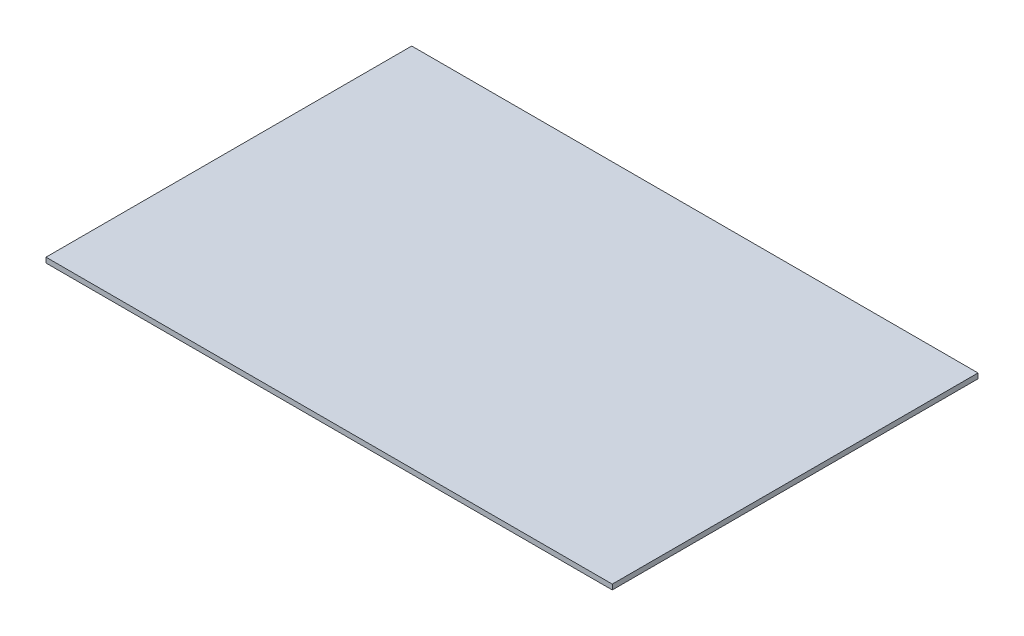
ISO-10303-21;
HEADER;
FILE_DESCRIPTION(('STEP AP214'),'2;1');
FILE_NAME('part.step','',(''),(''),'','','');
FILE_SCHEMA(('AUTOMOTIVE_DESIGN { 1 0 10303 214 1 1 1 1 }'));
ENDSEC;
DATA;
#1=APPLICATION_CONTEXT('core data for automotive mechanical design processes');
#2=APPLICATION_PROTOCOL_DEFINITION('international standard','automotive_design',2000,#1);
#3=PRODUCT_CONTEXT('',#1,'mechanical');
#4=PRODUCT('Part','Part','',(#3));
#5=PRODUCT_RELATED_PRODUCT_CATEGORY('part','',(#4));
#6=PRODUCT_DEFINITION_FORMATION('','',#4);
#7=PRODUCT_DEFINITION_CONTEXT('part definition',#1,'design');
#8=PRODUCT_DEFINITION('design','',#6,#7);
#9=PRODUCT_DEFINITION_SHAPE('','',#8);
#10=(LENGTH_UNIT() NAMED_UNIT(*) SI_UNIT(.MILLI.,.METRE.));
#11=(NAMED_UNIT(*) PLANE_ANGLE_UNIT() SI_UNIT($,.RADIAN.));
#12=(NAMED_UNIT(*) SI_UNIT($,.STERADIAN.) SOLID_ANGLE_UNIT());
#13=UNCERTAINTY_MEASURE_WITH_UNIT(LENGTH_MEASURE(1.E-05),#10,'distance_accuracy_value','');
#14=(GEOMETRIC_REPRESENTATION_CONTEXT(3) GLOBAL_UNCERTAINTY_ASSIGNED_CONTEXT((#13)) GLOBAL_UNIT_ASSIGNED_CONTEXT((#10,
#11,#12)) REPRESENTATION_CONTEXT('',''));
#15=CARTESIAN_POINT('',(0.,0.,0.));
#16=DIRECTION('',(0.,0.,1.));
#17=DIRECTION('',(1.,0.,0.));
#18=AXIS2_PLACEMENT_3D('',#15,#16,#17);
#19=CARTESIAN_POINT('',(0.,5.5,0.));
#20=DIRECTION('',(1.,0.,0.));
#21=DIRECTION('',(0.,0.,-1.));
#22=AXIS2_PLACEMENT_3D('',#19,#20,#21);
#23=PLANE('',#22);
#24=DIRECTION('',(0.,0.,1.));
#25=VECTOR('',#24,1.);
#26=CARTESIAN_POINT('',(0.,0.,0.));
#27=LINE('',#26,#25);
#28=CARTESIAN_POINT('',(0.,0.,-393.7));
#29=VERTEX_POINT('',#28);
#30=CARTESIAN_POINT('',(0.,0.,0.));
#31=VERTEX_POINT('',#30);
#32=EDGE_CURVE('E115',#29,#31,#27,.T.);
#33=ORIENTED_EDGE('',*,*,#32,.T.);
#34=DIRECTION('',(0.,-1.,0.));
#35=VECTOR('',#34,1.);
#36=CARTESIAN_POINT('',(0.,5.5,0.));
#37=LINE('',#36,#35);
#38=CARTESIAN_POINT('',(0.,5.5,0.));
#39=VERTEX_POINT('',#38);
#40=EDGE_CURVE('E11',#39,#31,#37,.T.);
#41=ORIENTED_EDGE('',*,*,#40,.F.);
#42=DIRECTION('',(0.,0.,1.));
#43=VECTOR('',#42,1.);
#44=CARTESIAN_POINT('',(0.,5.5,0.));
#45=LINE('',#44,#43);
#46=CARTESIAN_POINT('',(0.,5.5,-393.7));
#47=VERTEX_POINT('',#46);
#48=EDGE_CURVE('E99',#47,#39,#45,.T.);
#49=ORIENTED_EDGE('',*,*,#48,.F.);
#50=DIRECTION('',(0.,-1.,0.));
#51=VECTOR('',#50,1.);
#52=CARTESIAN_POINT('',(0.,5.5,-393.7));
#53=LINE('',#52,#51);
#54=EDGE_CURVE('E111',#47,#29,#53,.T.);
#55=ORIENTED_EDGE('',*,*,#54,.T.);
#56=EDGE_LOOP('',(#33,#41,#49,#55));
#57=FACE_BOUND('',#56,.T.);
#58=ADVANCED_FACE('F47',(#57),#23,.F.);
#59=CARTESIAN_POINT('',(0.,5.5,0.));
#60=DIRECTION('',(0.,0.,-1.));
#61=DIRECTION('',(-1.,0.,0.));
#62=AXIS2_PLACEMENT_3D('',#59,#60,#61);
#63=PLANE('',#62);
#64=DIRECTION('',(1.,0.,0.));
#65=VECTOR('',#64,1.);
#66=CARTESIAN_POINT('',(0.,0.,0.));
#67=LINE('',#66,#65);
#68=CARTESIAN_POINT('',(609.6,0.,0.));
#69=VERTEX_POINT('',#68);
#70=EDGE_CURVE('E104',#31,#69,#67,.T.);
#71=ORIENTED_EDGE('',*,*,#70,.T.);
#72=DIRECTION('',(0.,-1.,0.));
#73=VECTOR('',#72,1.);
#74=CARTESIAN_POINT('',(609.6,5.5,0.));
#75=LINE('',#74,#73);
#76=CARTESIAN_POINT('',(609.6,5.5,0.));
#77=VERTEX_POINT('',#76);
#78=EDGE_CURVE('E56',#77,#69,#75,.T.);
#79=ORIENTED_EDGE('',*,*,#78,.F.);
#80=DIRECTION('',(1.,0.,0.));
#81=VECTOR('',#80,1.);
#82=CARTESIAN_POINT('',(0.,5.5,0.));
#83=LINE('',#82,#81);
#84=EDGE_CURVE('E94',#39,#77,#83,.T.);
#85=ORIENTED_EDGE('',*,*,#84,.F.);
#86=ORIENTED_EDGE('',*,*,#40,.T.);
#87=EDGE_LOOP('',(#71,#79,#85,#86));
#88=FACE_BOUND('',#87,.T.);
#89=ADVANCED_FACE('F103',(#88),#63,.F.);
#90=CARTESIAN_POINT('',(609.6,5.5,0.));
#91=DIRECTION('',(-1.,0.,0.));
#92=DIRECTION('',(0.,0.,1.));
#93=AXIS2_PLACEMENT_3D('',#90,#91,#92);
#94=PLANE('',#93);
#95=DIRECTION('',(0.,0.,-1.));
#96=VECTOR('',#95,1.);
#97=CARTESIAN_POINT('',(609.6,0.,0.));
#98=LINE('',#97,#96);
#99=CARTESIAN_POINT('',(609.6,0.,-393.7));
#100=VERTEX_POINT('',#99);
#101=EDGE_CURVE('E81',#69,#100,#98,.T.);
#102=ORIENTED_EDGE('',*,*,#101,.T.);
#103=DIRECTION('',(0.,-1.,0.));
#104=VECTOR('',#103,1.);
#105=CARTESIAN_POINT('',(609.6,5.5,-393.7));
#106=LINE('',#105,#104);
#107=CARTESIAN_POINT('',(609.6,5.5,-393.7));
#108=VERTEX_POINT('',#107);
#109=EDGE_CURVE('E106',#108,#100,#106,.T.);
#110=ORIENTED_EDGE('',*,*,#109,.F.);
#111=DIRECTION('',(0.,0.,-1.));
#112=VECTOR('',#111,1.);
#113=CARTESIAN_POINT('',(609.6,5.5,0.));
#114=LINE('',#113,#112);
#115=EDGE_CURVE('E97',#77,#108,#114,.T.);
#116=ORIENTED_EDGE('',*,*,#115,.F.);
#117=ORIENTED_EDGE('',*,*,#78,.T.);
#118=EDGE_LOOP('',(#102,#110,#116,#117));
#119=FACE_BOUND('',#118,.T.);
#120=ADVANCED_FACE('F107',(#119),#94,.F.);
#121=CARTESIAN_POINT('',(0.,5.5,-393.7));
#122=DIRECTION('',(0.,0.,1.));
#123=DIRECTION('',(1.,0.,0.));
#124=AXIS2_PLACEMENT_3D('',#121,#122,#123);
#125=PLANE('',#124);
#126=DIRECTION('',(-1.,0.,0.));
#127=VECTOR('',#126,1.);
#128=CARTESIAN_POINT('',(0.,0.,-393.7));
#129=LINE('',#128,#127);
#130=EDGE_CURVE('E87',#100,#29,#129,.T.);
#131=ORIENTED_EDGE('',*,*,#130,.T.);
#132=ORIENTED_EDGE('',*,*,#54,.F.);
#133=DIRECTION('',(-1.,0.,0.));
#134=VECTOR('',#133,1.);
#135=CARTESIAN_POINT('',(0.,5.5,-393.7));
#136=LINE('',#135,#134);
#137=EDGE_CURVE('E64',#108,#47,#136,.T.);
#138=ORIENTED_EDGE('',*,*,#137,.F.);
#139=ORIENTED_EDGE('',*,*,#109,.T.);
#140=EDGE_LOOP('',(#131,#132,#138,#139));
#141=FACE_BOUND('',#140,.T.);
#142=ADVANCED_FACE('F128',(#141),#125,.F.);
#143=CARTESIAN_POINT('',(0.,5.5,0.));
#144=DIRECTION('',(0.,-1.,0.));
#145=DIRECTION('',(0.,0.,-1.));
#146=AXIS2_PLACEMENT_3D('',#143,#144,#145);
#147=PLANE('',#146);
#148=ORIENTED_EDGE('',*,*,#48,.T.);
#149=ORIENTED_EDGE('',*,*,#84,.T.);
#150=ORIENTED_EDGE('',*,*,#115,.T.);
#151=ORIENTED_EDGE('',*,*,#137,.T.);
#152=EDGE_LOOP('',(#148,#149,#150,#151));
#153=FACE_BOUND('',#152,.T.);
#154=ADVANCED_FACE('F95',(#153),#147,.F.);
#155=CARTESIAN_POINT('',(0.,0.,0.));
#156=DIRECTION('',(0.,-1.,0.));
#157=DIRECTION('',(0.,0.,-1.));
#158=AXIS2_PLACEMENT_3D('',#155,#156,#157);
#159=PLANE('',#158);
#160=ORIENTED_EDGE('',*,*,#32,.F.);
#161=ORIENTED_EDGE('',*,*,#130,.F.);
#162=ORIENTED_EDGE('',*,*,#101,.F.);
#163=ORIENTED_EDGE('',*,*,#70,.F.);
#164=EDGE_LOOP('',(#160,#161,#162,#163));
#165=FACE_BOUND('',#164,.T.);
#166=ADVANCED_FACE('F131',(#165),#159,.T.);
#167=CLOSED_SHELL('',(#58,#89,#120,#142,#154,#166));
#168=MANIFOLD_SOLID_BREP('B2',#167);
#169=ADVANCED_BREP_SHAPE_REPRESENTATION('',(#18,#168),#14);
#170=SHAPE_DEFINITION_REPRESENTATION(#9,#169);
ENDSEC;
END-ISO-10303-21;
